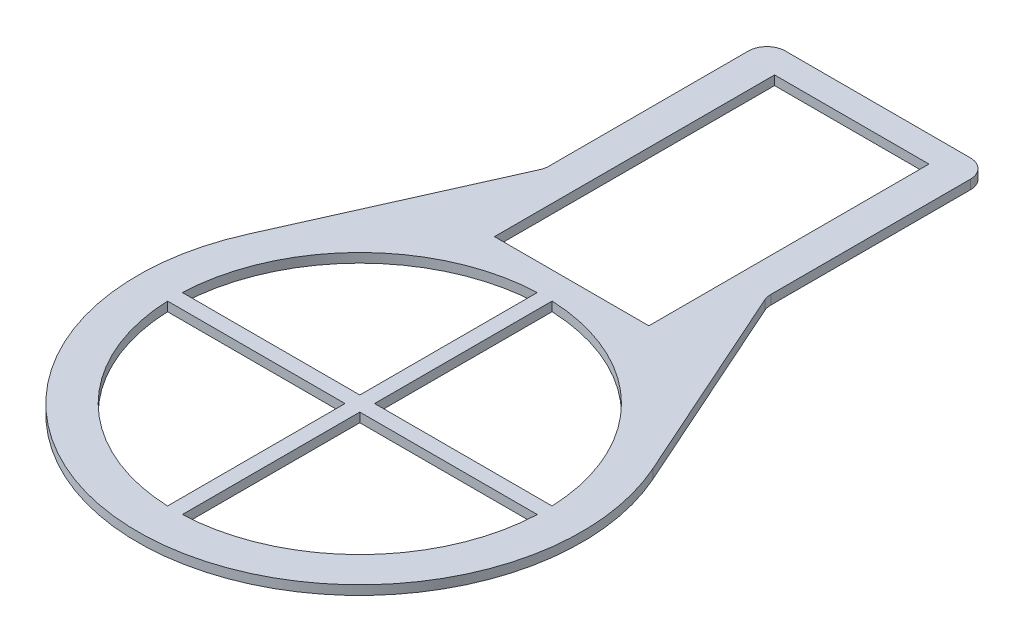
ISO-10303-21;
HEADER;
FILE_DESCRIPTION(('STEP AP214'),'2;1');
FILE_NAME('part.step','',(''),(''),'','','');
FILE_SCHEMA(('AUTOMOTIVE_DESIGN { 1 0 10303 214 1 1 1 1 }'));
ENDSEC;
DATA;
#1=APPLICATION_CONTEXT('core data for automotive mechanical design processes');
#2=APPLICATION_PROTOCOL_DEFINITION('international standard','automotive_design',2000,#1);
#3=PRODUCT_CONTEXT('',#1,'mechanical');
#4=PRODUCT('Part','Part','',(#3));
#5=PRODUCT_RELATED_PRODUCT_CATEGORY('part','',(#4));
#6=PRODUCT_DEFINITION_FORMATION('','',#4);
#7=PRODUCT_DEFINITION_CONTEXT('part definition',#1,'design');
#8=PRODUCT_DEFINITION('design','',#6,#7);
#9=PRODUCT_DEFINITION_SHAPE('','',#8);
#10=(LENGTH_UNIT() NAMED_UNIT(*) SI_UNIT(.MILLI.,.METRE.));
#11=(NAMED_UNIT(*) PLANE_ANGLE_UNIT() SI_UNIT($,.RADIAN.));
#12=(NAMED_UNIT(*) SI_UNIT($,.STERADIAN.) SOLID_ANGLE_UNIT());
#13=UNCERTAINTY_MEASURE_WITH_UNIT(LENGTH_MEASURE(1.E-05),#10,'distance_accuracy_value','');
#14=(GEOMETRIC_REPRESENTATION_CONTEXT(3) GLOBAL_UNCERTAINTY_ASSIGNED_CONTEXT((#13)) GLOBAL_UNIT_ASSIGNED_CONTEXT((#10,
#11,#12)) REPRESENTATION_CONTEXT('',''));
#15=CARTESIAN_POINT('',(0.,0.,0.));
#16=DIRECTION('',(0.,0.,1.));
#17=DIRECTION('',(1.,0.,0.));
#18=AXIS2_PLACEMENT_3D('',#15,#16,#17);
#19=CARTESIAN_POINT('',(0.,3.175,0.));
#20=DIRECTION('',(0.,-1.,0.));
#21=DIRECTION('',(0.,0.,-1.));
#22=AXIS2_PLACEMENT_3D('',#19,#20,#21);
#23=CYLINDRICAL_SURFACE('',#22,76.2);
#24=CARTESIAN_POINT('',(0.,0.,0.));
#25=DIRECTION('',(0.,1.,0.));
#26=DIRECTION('',(0.,0.,1.));
#27=AXIS2_PLACEMENT_3D('',#24,#25,#26);
#28=CIRCLE('',#27,76.2);
#29=CARTESIAN_POINT('',(-69.5842744995862,0.,-31.0558970626552));
#30=VERTEX_POINT('',#29);
#31=CARTESIAN_POINT('',(69.5842744995862,0.,-31.0558970626552));
#32=VERTEX_POINT('',#31);
#33=EDGE_CURVE('E335',#30,#32,#28,.T.);
#34=ORIENTED_EDGE('',*,*,#33,.T.);
#35=DIRECTION('',(0.,-1.,0.));
#36=VECTOR('',#35,1.);
#37=CARTESIAN_POINT('',(69.5842744995862,3.175,-31.0558970626552));
#38=LINE('',#37,#36);
#39=CARTESIAN_POINT('',(69.5842744995862,3.175,-31.0558970626552));
#40=VERTEX_POINT('',#39);
#41=EDGE_CURVE('E374',#40,#32,#38,.T.);
#42=ORIENTED_EDGE('',*,*,#41,.F.);
#43=CARTESIAN_POINT('',(0.,3.175,0.));
#44=DIRECTION('',(0.,1.,0.));
#45=DIRECTION('',(0.,0.,1.));
#46=AXIS2_PLACEMENT_3D('',#43,#44,#45);
#47=CIRCLE('',#46,76.2);
#48=CARTESIAN_POINT('',(-69.5842744995862,3.175,-31.0558970626552));
#49=VERTEX_POINT('',#48);
#50=EDGE_CURVE('E340',#49,#40,#47,.T.);
#51=ORIENTED_EDGE('',*,*,#50,.F.);
#52=DIRECTION('',(0.,-1.,0.));
#53=VECTOR('',#52,1.);
#54=CARTESIAN_POINT('',(-69.5842744995862,3.175,-31.0558970626552));
#55=LINE('',#54,#53);
#56=EDGE_CURVE('E357',#49,#30,#55,.T.);
#57=ORIENTED_EDGE('',*,*,#56,.T.);
#58=EDGE_LOOP('',(#34,#42,#51,#57));
#59=FACE_BOUND('',#58,.T.);
#60=ADVANCED_FACE('F35',(#59),#23,.T.);
#61=CARTESIAN_POINT('',(69.5842744995862,3.175,-31.0558970626552));
#62=DIRECTION('',(0.913179455375147,0.,-0.40755770423432));
#63=DIRECTION('',(-0.40755770423432,0.,-0.913179455375147));
#64=AXIS2_PLACEMENT_3D('',#61,#62,#63);
#65=PLANE('',#64);
#66=DIRECTION('',(0.40755770423432,0.,0.913179455375148));
#67=VECTOR('',#66,1.);
#68=CARTESIAN_POINT('',(69.5842744995862,0.,-31.0558970626552));
#69=LINE('',#68,#67);
#70=CARTESIAN_POINT('',(38.6513104583678,0.,-100.364726126179));
#71=VERTEX_POINT('',#70);
#72=EDGE_CURVE('E360',#71,#32,#69,.T.);
#73=ORIENTED_EDGE('',*,*,#72,.F.);
#74=DIRECTION('',(0.,-1.,0.));
#75=VECTOR('',#74,1.);
#76=CARTESIAN_POINT('',(38.6513104583678,3.175,-100.364726126179));
#77=LINE('',#76,#75);
#78=CARTESIAN_POINT('',(38.6513104583678,3.175,-100.364726126179));
#79=VERTEX_POINT('',#78);
#80=EDGE_CURVE('E403',#71,#79,#77,.F.);
#81=ORIENTED_EDGE('',*,*,#80,.T.);
#82=DIRECTION('',(0.40755770423432,0.,0.913179455375148));
#83=VECTOR('',#82,1.);
#84=CARTESIAN_POINT('',(69.5842744995862,3.175,-31.0558970626552));
#85=LINE('',#84,#83);
#86=EDGE_CURVE('E343',#79,#40,#85,.T.);
#87=ORIENTED_EDGE('',*,*,#86,.T.);
#88=ORIENTED_EDGE('',*,*,#41,.T.);
#89=EDGE_LOOP('',(#73,#81,#87,#88));
#90=FACE_BOUND('',#89,.T.);
#91=ADVANCED_FACE('F417',(#90),#65,.T.);
#92=CARTESIAN_POINT('',(38.1000000000001,3.175,0.));
#93=DIRECTION('',(1.,0.,0.));
#94=DIRECTION('',(0.,0.,-1.));
#95=AXIS2_PLACEMENT_3D('',#92,#93,#94);
#96=PLANE('',#95);
#97=DIRECTION('',(0.,0.,1.));
#98=VECTOR('',#97,1.);
#99=CARTESIAN_POINT('',(38.1000000000001,3.175,0.));
#100=LINE('',#99,#98);
#101=CARTESIAN_POINT('',(38.1,3.175,-171.45));
#102=VERTEX_POINT('',#101);
#103=CARTESIAN_POINT('',(38.1,3.175,-102.952717548067));
#104=VERTEX_POINT('',#103);
#105=EDGE_CURVE('E346',#102,#104,#100,.T.);
#106=ORIENTED_EDGE('',*,*,#105,.T.);
#107=DIRECTION('',(0.,-1.,0.));
#108=VECTOR('',#107,1.);
#109=CARTESIAN_POINT('',(38.1,0.,-102.952717548067));
#110=LINE('',#109,#108);
#111=CARTESIAN_POINT('',(38.1,0.,-102.952717548067));
#112=VERTEX_POINT('',#111);
#113=EDGE_CURVE('E400',#104,#112,#110,.T.);
#114=ORIENTED_EDGE('',*,*,#113,.T.);
#115=DIRECTION('',(0.,0.,1.));
#116=VECTOR('',#115,1.);
#117=CARTESIAN_POINT('',(38.1000000000001,0.,0.));
#118=LINE('',#117,#116);
#119=CARTESIAN_POINT('',(38.1,0.,-171.45));
#120=VERTEX_POINT('',#119);
#121=EDGE_CURVE('E362',#120,#112,#118,.T.);
#122=ORIENTED_EDGE('',*,*,#121,.F.);
#123=DIRECTION('',(0.,-1.,0.));
#124=VECTOR('',#123,1.);
#125=CARTESIAN_POINT('',(38.1,3.175,-171.45));
#126=LINE('',#125,#124);
#127=EDGE_CURVE('E398',#120,#102,#126,.F.);
#128=ORIENTED_EDGE('',*,*,#127,.T.);
#129=EDGE_LOOP('',(#106,#114,#122,#128));
#130=FACE_BOUND('',#129,.T.);
#131=ADVANCED_FACE('F428',(#130),#96,.T.);
#132=CARTESIAN_POINT('',(0.,3.175,-177.8));
#133=DIRECTION('',(0.,0.,-1.));
#134=DIRECTION('',(-1.,0.,0.));
#135=AXIS2_PLACEMENT_3D('',#132,#133,#134);
#136=PLANE('',#135);
#137=DIRECTION('',(1.,0.,0.));
#138=VECTOR('',#137,1.);
#139=CARTESIAN_POINT('',(0.,0.,-177.8));
#140=LINE('',#139,#138);
#141=CARTESIAN_POINT('',(-31.75,0.,-177.8));
#142=VERTEX_POINT('',#141);
#143=CARTESIAN_POINT('',(31.75,0.,-177.8));
#144=VERTEX_POINT('',#143);
#145=EDGE_CURVE('E365',#142,#144,#140,.T.);
#146=ORIENTED_EDGE('',*,*,#145,.F.);
#147=DIRECTION('',(0.,-1.,0.));
#148=VECTOR('',#147,1.);
#149=CARTESIAN_POINT('',(-31.75,3.175,-177.8));
#150=LINE('',#149,#148);
#151=CARTESIAN_POINT('',(-31.75,3.175,-177.8));
#152=VERTEX_POINT('',#151);
#153=EDGE_CURVE('E392',#142,#152,#150,.F.);
#154=ORIENTED_EDGE('',*,*,#153,.T.);
#155=DIRECTION('',(1.,0.,0.));
#156=VECTOR('',#155,1.);
#157=CARTESIAN_POINT('',(0.,3.175,-177.8));
#158=LINE('',#157,#156);
#159=CARTESIAN_POINT('',(31.75,3.175,-177.8));
#160=VERTEX_POINT('',#159);
#161=EDGE_CURVE('E349',#152,#160,#158,.T.);
#162=ORIENTED_EDGE('',*,*,#161,.T.);
#163=DIRECTION('',(0.,-1.,0.));
#164=VECTOR('',#163,1.);
#165=CARTESIAN_POINT('',(31.75,3.175,-177.8));
#166=LINE('',#165,#164);
#167=EDGE_CURVE('E389',#160,#144,#166,.T.);
#168=ORIENTED_EDGE('',*,*,#167,.T.);
#169=EDGE_LOOP('',(#146,#154,#162,#168));
#170=FACE_BOUND('',#169,.T.);
#171=ADVANCED_FACE('F435',(#170),#136,.T.);
#172=CARTESIAN_POINT('',(-38.1,3.175,0.));
#173=DIRECTION('',(1.,0.,0.));
#174=DIRECTION('',(0.,0.,-1.));
#175=AXIS2_PLACEMENT_3D('',#172,#173,#174);
#176=PLANE('',#175);
#177=DIRECTION('',(0.,0.,1.));
#178=VECTOR('',#177,1.);
#179=CARTESIAN_POINT('',(-38.1,0.,0.));
#180=LINE('',#179,#178);
#181=CARTESIAN_POINT('',(-38.1,0.,-171.45));
#182=VERTEX_POINT('',#181);
#183=CARTESIAN_POINT('',(-38.1,0.,-102.952717548067));
#184=VERTEX_POINT('',#183);
#185=EDGE_CURVE('E368',#182,#184,#180,.T.);
#186=ORIENTED_EDGE('',*,*,#185,.T.);
#187=DIRECTION('',(0.,-1.,0.));
#188=VECTOR('',#187,1.);
#189=CARTESIAN_POINT('',(-38.1,3.175,-102.952717548067));
#190=LINE('',#189,#188);
#191=CARTESIAN_POINT('',(-38.1,3.175,-102.952717548067));
#192=VERTEX_POINT('',#191);
#193=EDGE_CURVE('E383',#184,#192,#190,.F.);
#194=ORIENTED_EDGE('',*,*,#193,.T.);
#195=DIRECTION('',(0.,0.,1.));
#196=VECTOR('',#195,1.);
#197=CARTESIAN_POINT('',(-38.1,3.175,0.));
#198=LINE('',#197,#196);
#199=CARTESIAN_POINT('',(-38.1,3.175,-171.45));
#200=VERTEX_POINT('',#199);
#201=EDGE_CURVE('E352',#200,#192,#198,.T.);
#202=ORIENTED_EDGE('',*,*,#201,.F.);
#203=DIRECTION('',(0.,-1.,0.));
#204=VECTOR('',#203,1.);
#205=CARTESIAN_POINT('',(-38.1,0.,-171.45));
#206=LINE('',#205,#204);
#207=EDGE_CURVE('E380',#200,#182,#206,.T.);
#208=ORIENTED_EDGE('',*,*,#207,.T.);
#209=EDGE_LOOP('',(#186,#194,#202,#208));
#210=FACE_BOUND('',#209,.T.);
#211=ADVANCED_FACE('F443',(#210),#176,.F.);
#212=CARTESIAN_POINT('',(-69.5842744995862,3.175,-31.0558970626552));
#213=DIRECTION('',(0.913179455375147,0.,0.40755770423432));
#214=DIRECTION('',(0.40755770423432,0.,-0.913179455375147));
#215=AXIS2_PLACEMENT_3D('',#212,#213,#214);
#216=PLANE('',#215);
#217=DIRECTION('',(-0.40755770423432,0.,0.913179455375147));
#218=VECTOR('',#217,1.);
#219=CARTESIAN_POINT('',(-69.5842744995862,3.175,-31.0558970626552));
#220=LINE('',#219,#218);
#221=CARTESIAN_POINT('',(-38.6513104583678,3.175,-100.364726126179));
#222=VERTEX_POINT('',#221);
#223=EDGE_CURVE('E355',#222,#49,#220,.T.);
#224=ORIENTED_EDGE('',*,*,#223,.F.);
#225=DIRECTION('',(0.,-1.,0.));
#226=VECTOR('',#225,1.);
#227=CARTESIAN_POINT('',(-38.6513104583678,0.,-100.364726126179));
#228=LINE('',#227,#226);
#229=CARTESIAN_POINT('',(-38.6513104583678,0.,-100.364726126179));
#230=VERTEX_POINT('',#229);
#231=EDGE_CURVE('E377',#222,#230,#228,.T.);
#232=ORIENTED_EDGE('',*,*,#231,.T.);
#233=DIRECTION('',(-0.40755770423432,0.,0.913179455375147));
#234=VECTOR('',#233,1.);
#235=CARTESIAN_POINT('',(-69.5842744995862,0.,-31.0558970626552));
#236=LINE('',#235,#234);
#237=EDGE_CURVE('E344',#230,#30,#236,.T.);
#238=ORIENTED_EDGE('',*,*,#237,.T.);
#239=ORIENTED_EDGE('',*,*,#56,.F.);
#240=EDGE_LOOP('',(#224,#232,#238,#239));
#241=FACE_BOUND('',#240,.T.);
#242=ADVANCED_FACE('F451',(#241),#216,.F.);
#243=CARTESIAN_POINT('',(0.,3.175,0.));
#244=DIRECTION('',(0.,1.,0.));
#245=DIRECTION('',(0.,0.,1.));
#246=AXIS2_PLACEMENT_3D('',#243,#244,#245);
#247=PLANE('',#246);
#248=DIRECTION('',(0.,0.,-1.));
#249=VECTOR('',#248,1.);
#250=CARTESIAN_POINT('',(26.4947526390494,3.175,-72.7091223745985));
#251=LINE('',#250,#249);
#252=CARTESIAN_POINT('',(26.4947526390494,3.175,-72.7091223745985));
#253=VERTEX_POINT('',#252);
#254=CARTESIAN_POINT('',(26.4947526390494,3.175,-168.837519770124));
#255=VERTEX_POINT('',#254);
#256=EDGE_CURVE('E50',#253,#255,#251,.T.);
#257=ORIENTED_EDGE('',*,*,#256,.F.);
#258=DIRECTION('',(1.,0.,0.));
#259=VECTOR('',#258,1.);
#260=CARTESIAN_POINT('',(-26.4947526390494,3.175,-72.7091223745985));
#261=LINE('',#260,#259);
#262=CARTESIAN_POINT('',(-26.4947526390494,3.175,-72.7091223745985));
#263=VERTEX_POINT('',#262);
#264=EDGE_CURVE('E225',#263,#253,#261,.T.);
#265=ORIENTED_EDGE('',*,*,#264,.F.);
#266=DIRECTION('',(0.,0.,1.));
#267=VECTOR('',#266,1.);
#268=CARTESIAN_POINT('',(-26.4947526390494,3.175,-72.7091223745985));
#269=LINE('',#268,#267);
#270=CARTESIAN_POINT('',(-26.4947526390494,3.175,-168.837519770124));
#271=VERTEX_POINT('',#270);
#272=EDGE_CURVE('E228',#271,#263,#269,.T.);
#273=ORIENTED_EDGE('',*,*,#272,.F.);
#274=DIRECTION('',(-1.,0.,0.));
#275=VECTOR('',#274,1.);
#276=CARTESIAN_POINT('',(-26.4947526390494,3.175,-168.837519770124));
#277=LINE('',#276,#275);
#278=EDGE_CURVE('E234',#255,#271,#277,.T.);
#279=ORIENTED_EDGE('',*,*,#278,.F.);
#280=EDGE_LOOP('',(#257,#265,#273,#279));
#281=FACE_BOUND('',#280,.T.);
#282=DIRECTION('',(-1.,0.,0.));
#283=VECTOR('',#282,1.);
#284=CARTESIAN_POINT('',(0.,3.175,2.54));
#285=LINE('',#284,#283);
#286=CARTESIAN_POINT('',(-2.54,3.175,2.54));
#287=VERTEX_POINT('',#286);
#288=CARTESIAN_POINT('',(-63.4491796637277,3.175,2.54));
#289=VERTEX_POINT('',#288);
#290=EDGE_CURVE('E240',#287,#289,#285,.T.);
#291=ORIENTED_EDGE('',*,*,#290,.F.);
#292=DIRECTION('',(0.,0.,1.));
#293=VECTOR('',#292,1.);
#294=CARTESIAN_POINT('',(-2.54,3.175,0.));
#295=LINE('',#294,#293);
#296=CARTESIAN_POINT('',(-2.54,3.175,63.4491796637277));
#297=VERTEX_POINT('',#296);
#298=EDGE_CURVE('E298',#287,#297,#295,.T.);
#299=ORIENTED_EDGE('',*,*,#298,.T.);
#300=CARTESIAN_POINT('',(0.,3.175,0.));
#301=DIRECTION('',(0.,1.,0.));
#302=DIRECTION('',(0.,0.,1.));
#303=AXIS2_PLACEMENT_3D('',#300,#301,#302);
#304=CIRCLE('',#303,63.5);
#305=EDGE_CURVE('E306',#289,#297,#304,.T.);
#306=ORIENTED_EDGE('',*,*,#305,.F.);
#307=EDGE_LOOP('',(#291,#299,#306));
#308=FACE_BOUND('',#307,.T.);
#309=DIRECTION('',(0.,0.,1.));
#310=VECTOR('',#309,1.);
#311=CARTESIAN_POINT('',(2.54,3.175,0.));
#312=LINE('',#311,#310);
#313=CARTESIAN_POINT('',(2.54,3.175,2.54));
#314=VERTEX_POINT('',#313);
#315=CARTESIAN_POINT('',(2.54,3.175,63.4491796637277));
#316=VERTEX_POINT('',#315);
#317=EDGE_CURVE('E281',#314,#316,#312,.T.);
#318=ORIENTED_EDGE('',*,*,#317,.F.);
#319=DIRECTION('',(1.,0.,0.));
#320=VECTOR('',#319,1.);
#321=CARTESIAN_POINT('',(0.,3.175,2.54));
#322=LINE('',#321,#320);
#323=CARTESIAN_POINT('',(63.4491796637277,3.175,2.54));
#324=VERTEX_POINT('',#323);
#325=EDGE_CURVE('E274',#314,#324,#322,.T.);
#326=ORIENTED_EDGE('',*,*,#325,.T.);
#327=CARTESIAN_POINT('',(0.,3.175,0.));
#328=DIRECTION('',(0.,1.,0.));
#329=DIRECTION('',(0.,0.,1.));
#330=AXIS2_PLACEMENT_3D('',#327,#328,#329);
#331=CIRCLE('',#330,63.5);
#332=EDGE_CURVE('E283',#316,#324,#331,.T.);
#333=ORIENTED_EDGE('',*,*,#332,.F.);
#334=EDGE_LOOP('',(#318,#326,#333));
#335=FACE_BOUND('',#334,.T.);
#336=DIRECTION('',(1.,0.,0.));
#337=VECTOR('',#336,1.);
#338=CARTESIAN_POINT('',(0.,3.175,-2.54));
#339=LINE('',#338,#337);
#340=CARTESIAN_POINT('',(2.54,3.175,-2.54));
#341=VERTEX_POINT('',#340);
#342=CARTESIAN_POINT('',(63.4491796637277,3.175,-2.54));
#343=VERTEX_POINT('',#342);
#344=EDGE_CURVE('E255',#341,#343,#339,.T.);
#345=ORIENTED_EDGE('',*,*,#344,.F.);
#346=DIRECTION('',(0.,0.,-1.));
#347=VECTOR('',#346,1.);
#348=CARTESIAN_POINT('',(2.54,3.175,0.));
#349=LINE('',#348,#347);
#350=CARTESIAN_POINT('',(2.54,3.175,-63.4491796637277));
#351=VERTEX_POINT('',#350);
#352=EDGE_CURVE('E248',#341,#351,#349,.T.);
#353=ORIENTED_EDGE('',*,*,#352,.T.);
#354=CARTESIAN_POINT('',(0.,3.175,0.));
#355=DIRECTION('',(0.,1.,0.));
#356=DIRECTION('',(0.,0.,1.));
#357=AXIS2_PLACEMENT_3D('',#354,#355,#356);
#358=CIRCLE('',#357,63.5);
#359=EDGE_CURVE('E257',#343,#351,#358,.T.);
#360=ORIENTED_EDGE('',*,*,#359,.F.);
#361=EDGE_LOOP('',(#345,#353,#360));
#362=FACE_BOUND('',#361,.T.);
#363=DIRECTION('',(0.,0.,-1.));
#364=VECTOR('',#363,1.);
#365=CARTESIAN_POINT('',(-2.54,3.175,0.));
#366=LINE('',#365,#364);
#367=CARTESIAN_POINT('',(-2.54,3.175,-2.54));
#368=VERTEX_POINT('',#367);
#369=CARTESIAN_POINT('',(-2.54,3.175,-63.4491796637277));
#370=VERTEX_POINT('',#369);
#371=EDGE_CURVE('E265',#368,#370,#366,.T.);
#372=ORIENTED_EDGE('',*,*,#371,.F.);
#373=DIRECTION('',(-1.,0.,0.));
#374=VECTOR('',#373,1.);
#375=CARTESIAN_POINT('',(0.,3.175,-2.54));
#376=LINE('',#375,#374);
#377=CARTESIAN_POINT('',(-63.4491796637277,3.175,-2.54));
#378=VERTEX_POINT('',#377);
#379=EDGE_CURVE('E320',#368,#378,#376,.T.);
#380=ORIENTED_EDGE('',*,*,#379,.T.);
#381=CARTESIAN_POINT('',(0.,3.175,0.));
#382=DIRECTION('',(0.,1.,0.));
#383=DIRECTION('',(0.,0.,1.));
#384=AXIS2_PLACEMENT_3D('',#381,#382,#383);
#385=CIRCLE('',#384,63.5);
#386=EDGE_CURVE('E328',#370,#378,#385,.T.);
#387=ORIENTED_EDGE('',*,*,#386,.F.);
#388=EDGE_LOOP('',(#372,#380,#387));
#389=FACE_BOUND('',#388,.T.);
#390=ORIENTED_EDGE('',*,*,#161,.F.);
#391=CARTESIAN_POINT('',(-31.75,3.175,-171.45));
#392=DIRECTION('',(0.,1.,0.));
#393=DIRECTION('',(0.,0.,1.));
#394=AXIS2_PLACEMENT_3D('',#391,#392,#393);
#395=CIRCLE('',#394,6.35);
#396=EDGE_CURVE('E396',#152,#200,#395,.T.);
#397=ORIENTED_EDGE('',*,*,#396,.T.);
#398=ORIENTED_EDGE('',*,*,#201,.T.);
#399=CARTESIAN_POINT('',(-44.45,3.175,-102.952717548067));
#400=DIRECTION('',(0.,1.,0.));
#401=DIRECTION('',(0.,0.,1.));
#402=AXIS2_PLACEMENT_3D('',#399,#400,#401);
#403=CIRCLE('',#402,6.35);
#404=EDGE_CURVE('E407',#192,#222,#403,.F.);
#405=ORIENTED_EDGE('',*,*,#404,.T.);
#406=ORIENTED_EDGE('',*,*,#223,.T.);
#407=ORIENTED_EDGE('',*,*,#50,.T.);
#408=ORIENTED_EDGE('',*,*,#86,.F.);
#409=CARTESIAN_POINT('',(44.45,3.175,-102.952717548067));
#410=DIRECTION('',(0.,1.,0.));
#411=DIRECTION('',(0.,0.,1.));
#412=AXIS2_PLACEMENT_3D('',#409,#410,#411);
#413=CIRCLE('',#412,6.35);
#414=EDGE_CURVE('E11',#79,#104,#413,.F.);
#415=ORIENTED_EDGE('',*,*,#414,.T.);
#416=ORIENTED_EDGE('',*,*,#105,.F.);
#417=CARTESIAN_POINT('',(31.75,3.175,-171.45));
#418=DIRECTION('',(0.,1.,0.));
#419=DIRECTION('',(0.,0.,1.));
#420=AXIS2_PLACEMENT_3D('',#417,#418,#419);
#421=CIRCLE('',#420,6.35);
#422=EDGE_CURVE('E394',#102,#160,#421,.T.);
#423=ORIENTED_EDGE('',*,*,#422,.T.);
#424=EDGE_LOOP('',(#390,#397,#398,#405,#406,#407,#408,#415,#416,#423));
#425=FACE_BOUND('',#424,.T.);
#426=ADVANCED_FACE('F425',(#281,#308,#335,#362,#389,#425),#247,.T.);
#427=CARTESIAN_POINT('',(0.,0.,0.));
#428=DIRECTION('',(0.,1.,0.));
#429=DIRECTION('',(0.,0.,1.));
#430=AXIS2_PLACEMENT_3D('',#427,#428,#429);
#431=PLANE('',#430);
#432=DIRECTION('',(1.,0.,0.));
#433=VECTOR('',#432,1.);
#434=CARTESIAN_POINT('',(-26.4947526390494,0.,-72.7091223745985));
#435=LINE('',#434,#433);
#436=CARTESIAN_POINT('',(-26.4947526390494,0.,-72.7091223745985));
#437=VERTEX_POINT('',#436);
#438=CARTESIAN_POINT('',(26.4947526390494,0.,-72.7091223745985));
#439=VERTEX_POINT('',#438);
#440=EDGE_CURVE('E215',#437,#439,#435,.T.);
#441=ORIENTED_EDGE('',*,*,#440,.T.);
#442=DIRECTION('',(0.,0.,-1.));
#443=VECTOR('',#442,1.);
#444=CARTESIAN_POINT('',(26.4947526390494,0.,-72.7091223745985));
#445=LINE('',#444,#443);
#446=CARTESIAN_POINT('',(26.4947526390494,0.,-168.837519770124));
#447=VERTEX_POINT('',#446);
#448=EDGE_CURVE('E209',#439,#447,#445,.T.);
#449=ORIENTED_EDGE('',*,*,#448,.T.);
#450=DIRECTION('',(-1.,0.,0.));
#451=VECTOR('',#450,1.);
#452=CARTESIAN_POINT('',(-26.4947526390494,0.,-168.837519770124));
#453=LINE('',#452,#451);
#454=CARTESIAN_POINT('',(-26.4947526390494,0.,-168.837519770124));
#455=VERTEX_POINT('',#454);
#456=EDGE_CURVE('E218',#447,#455,#453,.T.);
#457=ORIENTED_EDGE('',*,*,#456,.T.);
#458=DIRECTION('',(0.,0.,1.));
#459=VECTOR('',#458,1.);
#460=CARTESIAN_POINT('',(-26.4947526390494,0.,-72.7091223745985));
#461=LINE('',#460,#459);
#462=EDGE_CURVE('E58',#455,#437,#461,.T.);
#463=ORIENTED_EDGE('',*,*,#462,.T.);
#464=EDGE_LOOP('',(#441,#449,#457,#463));
#465=FACE_BOUND('',#464,.T.);
#466=DIRECTION('',(0.,0.,1.));
#467=VECTOR('',#466,1.);
#468=CARTESIAN_POINT('',(-2.54,0.,0.));
#469=LINE('',#468,#467);
#470=CARTESIAN_POINT('',(-2.54,0.,2.54));
#471=VERTEX_POINT('',#470);
#472=CARTESIAN_POINT('',(-2.54,0.,63.4491796637277));
#473=VERTEX_POINT('',#472);
#474=EDGE_CURVE('E301',#471,#473,#469,.T.);
#475=ORIENTED_EDGE('',*,*,#474,.F.);
#476=DIRECTION('',(-1.,0.,0.));
#477=VECTOR('',#476,1.);
#478=CARTESIAN_POINT('',(0.,0.,2.54));
#479=LINE('',#478,#477);
#480=CARTESIAN_POINT('',(-63.4491796637277,0.,2.54));
#481=VERTEX_POINT('',#480);
#482=EDGE_CURVE('E294',#471,#481,#479,.T.);
#483=ORIENTED_EDGE('',*,*,#482,.T.);
#484=CARTESIAN_POINT('',(0.,0.,0.));
#485=DIRECTION('',(0.,1.,0.));
#486=DIRECTION('',(0.,0.,1.));
#487=AXIS2_PLACEMENT_3D('',#484,#485,#486);
#488=CIRCLE('',#487,63.5);
#489=EDGE_CURVE('E297',#481,#473,#488,.T.);
#490=ORIENTED_EDGE('',*,*,#489,.T.);
#491=EDGE_LOOP('',(#475,#483,#490));
#492=FACE_BOUND('',#491,.T.);
#493=DIRECTION('',(1.,0.,0.));
#494=VECTOR('',#493,1.);
#495=CARTESIAN_POINT('',(0.,0.,2.54));
#496=LINE('',#495,#494);
#497=CARTESIAN_POINT('',(2.54,0.,2.54));
#498=VERTEX_POINT('',#497);
#499=CARTESIAN_POINT('',(63.4491796637277,0.,2.54));
#500=VERTEX_POINT('',#499);
#501=EDGE_CURVE('E277',#498,#500,#496,.T.);
#502=ORIENTED_EDGE('',*,*,#501,.F.);
#503=DIRECTION('',(0.,0.,1.));
#504=VECTOR('',#503,1.);
#505=CARTESIAN_POINT('',(2.54,0.,0.));
#506=LINE('',#505,#504);
#507=CARTESIAN_POINT('',(2.54,0.,63.4491796637277));
#508=VERTEX_POINT('',#507);
#509=EDGE_CURVE('E270',#498,#508,#506,.T.);
#510=ORIENTED_EDGE('',*,*,#509,.T.);
#511=CARTESIAN_POINT('',(0.,0.,0.));
#512=DIRECTION('',(0.,1.,0.));
#513=DIRECTION('',(0.,0.,1.));
#514=AXIS2_PLACEMENT_3D('',#511,#512,#513);
#515=CIRCLE('',#514,63.5);
#516=EDGE_CURVE('E273',#508,#500,#515,.T.);
#517=ORIENTED_EDGE('',*,*,#516,.T.);
#518=EDGE_LOOP('',(#502,#510,#517));
#519=FACE_BOUND('',#518,.T.);
#520=DIRECTION('',(0.,0.,-1.));
#521=VECTOR('',#520,1.);
#522=CARTESIAN_POINT('',(2.54,0.,0.));
#523=LINE('',#522,#521);
#524=CARTESIAN_POINT('',(2.54,0.,-2.54));
#525=VERTEX_POINT('',#524);
#526=CARTESIAN_POINT('',(2.54,0.,-63.4491796637277));
#527=VERTEX_POINT('',#526);
#528=EDGE_CURVE('E251',#525,#527,#523,.T.);
#529=ORIENTED_EDGE('',*,*,#528,.F.);
#530=DIRECTION('',(1.,0.,0.));
#531=VECTOR('',#530,1.);
#532=CARTESIAN_POINT('',(0.,0.,-2.54));
#533=LINE('',#532,#531);
#534=CARTESIAN_POINT('',(63.4491796637277,0.,-2.54));
#535=VERTEX_POINT('',#534);
#536=EDGE_CURVE('E244',#525,#535,#533,.T.);
#537=ORIENTED_EDGE('',*,*,#536,.T.);
#538=CARTESIAN_POINT('',(0.,0.,0.));
#539=DIRECTION('',(0.,1.,0.));
#540=DIRECTION('',(0.,0.,1.));
#541=AXIS2_PLACEMENT_3D('',#538,#539,#540);
#542=CIRCLE('',#541,63.5);
#543=EDGE_CURVE('E247',#535,#527,#542,.T.);
#544=ORIENTED_EDGE('',*,*,#543,.T.);
#545=EDGE_LOOP('',(#529,#537,#544));
#546=FACE_BOUND('',#545,.T.);
#547=DIRECTION('',(-1.,0.,0.));
#548=VECTOR('',#547,1.);
#549=CARTESIAN_POINT('',(0.,0.,-2.54));
#550=LINE('',#549,#548);
#551=CARTESIAN_POINT('',(-2.54,0.,-2.54));
#552=VERTEX_POINT('',#551);
#553=CARTESIAN_POINT('',(-63.4491796637277,0.,-2.54));
#554=VERTEX_POINT('',#553);
#555=EDGE_CURVE('E323',#552,#554,#550,.T.);
#556=ORIENTED_EDGE('',*,*,#555,.F.);
#557=DIRECTION('',(0.,0.,-1.));
#558=VECTOR('',#557,1.);
#559=CARTESIAN_POINT('',(-2.54,0.,0.));
#560=LINE('',#559,#558);
#561=CARTESIAN_POINT('',(-2.54,0.,-63.4491796637277));
#562=VERTEX_POINT('',#561);
#563=EDGE_CURVE('E316',#552,#562,#560,.T.);
#564=ORIENTED_EDGE('',*,*,#563,.T.);
#565=CARTESIAN_POINT('',(0.,0.,0.));
#566=DIRECTION('',(0.,1.,0.));
#567=DIRECTION('',(0.,0.,1.));
#568=AXIS2_PLACEMENT_3D('',#565,#566,#567);
#569=CIRCLE('',#568,63.5);
#570=EDGE_CURVE('E319',#562,#554,#569,.T.);
#571=ORIENTED_EDGE('',*,*,#570,.T.);
#572=EDGE_LOOP('',(#556,#564,#571));
#573=FACE_BOUND('',#572,.T.);
#574=ORIENTED_EDGE('',*,*,#185,.F.);
#575=CARTESIAN_POINT('',(-31.75,0.,-171.45));
#576=DIRECTION('',(0.,1.,0.));
#577=DIRECTION('',(0.,0.,1.));
#578=AXIS2_PLACEMENT_3D('',#575,#576,#577);
#579=CIRCLE('',#578,6.35);
#580=EDGE_CURVE('E387',#182,#142,#579,.F.);
#581=ORIENTED_EDGE('',*,*,#580,.T.);
#582=ORIENTED_EDGE('',*,*,#145,.T.);
#583=CARTESIAN_POINT('',(31.75,0.,-171.45));
#584=DIRECTION('',(0.,1.,0.));
#585=DIRECTION('',(0.,0.,1.));
#586=AXIS2_PLACEMENT_3D('',#583,#584,#585);
#587=CIRCLE('',#586,6.35);
#588=EDGE_CURVE('E385',#144,#120,#587,.F.);
#589=ORIENTED_EDGE('',*,*,#588,.T.);
#590=ORIENTED_EDGE('',*,*,#121,.T.);
#591=CARTESIAN_POINT('',(44.45,0.,-102.952717548067));
#592=DIRECTION('',(0.,1.,0.));
#593=DIRECTION('',(0.,0.,1.));
#594=AXIS2_PLACEMENT_3D('',#591,#592,#593);
#595=CIRCLE('',#594,6.35);
#596=EDGE_CURVE('E43',#112,#71,#595,.T.);
#597=ORIENTED_EDGE('',*,*,#596,.T.);
#598=ORIENTED_EDGE('',*,*,#72,.T.);
#599=ORIENTED_EDGE('',*,*,#33,.F.);
#600=ORIENTED_EDGE('',*,*,#237,.F.);
#601=CARTESIAN_POINT('',(-44.45,0.,-102.952717548067));
#602=DIRECTION('',(0.,1.,0.));
#603=DIRECTION('',(0.,0.,1.));
#604=AXIS2_PLACEMENT_3D('',#601,#602,#603);
#605=CIRCLE('',#604,6.35);
#606=EDGE_CURVE('E405',#230,#184,#605,.T.);
#607=ORIENTED_EDGE('',*,*,#606,.T.);
#608=EDGE_LOOP('',(#574,#581,#582,#589,#590,#597,#598,#599,#600,#607));
#609=FACE_BOUND('',#608,.T.);
#610=ADVANCED_FACE('F222',(#465,#492,#519,#546,#573,#609),#431,.F.);
#611=CARTESIAN_POINT('',(-44.45,3.175,-102.952717548067));
#612=DIRECTION('',(0.,1.,0.));
#613=DIRECTION('',(0.,0.,1.));
#614=AXIS2_PLACEMENT_3D('',#611,#612,#613);
#615=CYLINDRICAL_SURFACE('',#614,6.35);
#616=ORIENTED_EDGE('',*,*,#404,.F.);
#617=ORIENTED_EDGE('',*,*,#193,.F.);
#618=ORIENTED_EDGE('',*,*,#606,.F.);
#619=ORIENTED_EDGE('',*,*,#231,.F.);
#620=EDGE_LOOP('',(#616,#617,#618,#619));
#621=FACE_BOUND('',#620,.T.);
#622=ADVANCED_FACE('F446',(#621),#615,.F.);
#623=CARTESIAN_POINT('',(-31.75,3.175,-171.45));
#624=DIRECTION('',(0.,1.,0.));
#625=DIRECTION('',(0.,0.,1.));
#626=AXIS2_PLACEMENT_3D('',#623,#624,#625);
#627=CYLINDRICAL_SURFACE('',#626,6.35);
#628=ORIENTED_EDGE('',*,*,#396,.F.);
#629=ORIENTED_EDGE('',*,*,#153,.F.);
#630=ORIENTED_EDGE('',*,*,#580,.F.);
#631=ORIENTED_EDGE('',*,*,#207,.F.);
#632=EDGE_LOOP('',(#628,#629,#630,#631));
#633=FACE_BOUND('',#632,.T.);
#634=ADVANCED_FACE('F438',(#633),#627,.T.);
#635=CARTESIAN_POINT('',(44.45,3.175,-102.952717548067));
#636=DIRECTION('',(0.,1.,0.));
#637=DIRECTION('',(0.,0.,1.));
#638=AXIS2_PLACEMENT_3D('',#635,#636,#637);
#639=CYLINDRICAL_SURFACE('',#638,6.35);
#640=ORIENTED_EDGE('',*,*,#414,.F.);
#641=ORIENTED_EDGE('',*,*,#80,.F.);
#642=ORIENTED_EDGE('',*,*,#596,.F.);
#643=ORIENTED_EDGE('',*,*,#113,.F.);
#644=EDGE_LOOP('',(#640,#641,#642,#643));
#645=FACE_BOUND('',#644,.T.);
#646=ADVANCED_FACE('F421',(#645),#639,.F.);
#647=CARTESIAN_POINT('',(31.75,3.175,-171.45));
#648=DIRECTION('',(0.,-1.,0.));
#649=DIRECTION('',(0.,0.,-1.));
#650=AXIS2_PLACEMENT_3D('',#647,#648,#649);
#651=CYLINDRICAL_SURFACE('',#650,6.35);
#652=ORIENTED_EDGE('',*,*,#422,.F.);
#653=ORIENTED_EDGE('',*,*,#127,.F.);
#654=ORIENTED_EDGE('',*,*,#588,.F.);
#655=ORIENTED_EDGE('',*,*,#167,.F.);
#656=EDGE_LOOP('',(#652,#653,#654,#655));
#657=FACE_BOUND('',#656,.T.);
#658=ADVANCED_FACE('F37',(#657),#651,.T.);
#659=CARTESIAN_POINT('',(-2.54,0.,0.));
#660=DIRECTION('',(1.,0.,0.));
#661=DIRECTION('',(0.,0.,-1.));
#662=AXIS2_PLACEMENT_3D('',#659,#660,#661);
#663=PLANE('',#662);
#664=ORIENTED_EDGE('',*,*,#371,.T.);
#665=DIRECTION('',(0.,1.,0.));
#666=VECTOR('',#665,1.);
#667=CARTESIAN_POINT('',(-2.54,0.,-63.4491796637277));
#668=LINE('',#667,#666);
#669=EDGE_CURVE('E326',#562,#370,#668,.T.);
#670=ORIENTED_EDGE('',*,*,#669,.F.);
#671=ORIENTED_EDGE('',*,*,#563,.F.);
#672=DIRECTION('',(0.,1.,0.));
#673=VECTOR('',#672,1.);
#674=CARTESIAN_POINT('',(-2.54,0.,-2.54));
#675=LINE('',#674,#673);
#676=EDGE_CURVE('E333',#552,#368,#675,.T.);
#677=ORIENTED_EDGE('',*,*,#676,.T.);
#678=EDGE_LOOP('',(#664,#670,#671,#677));
#679=FACE_BOUND('',#678,.T.);
#680=ADVANCED_FACE('F470',(#679),#663,.F.);
#681=CARTESIAN_POINT('',(0.,0.,-2.54));
#682=DIRECTION('',(0.,0.,-1.));
#683=DIRECTION('',(-1.,0.,0.));
#684=AXIS2_PLACEMENT_3D('',#681,#682,#683);
#685=PLANE('',#684);
#686=ORIENTED_EDGE('',*,*,#379,.F.);
#687=ORIENTED_EDGE('',*,*,#676,.F.);
#688=ORIENTED_EDGE('',*,*,#555,.T.);
#689=DIRECTION('',(0.,1.,0.));
#690=VECTOR('',#689,1.);
#691=CARTESIAN_POINT('',(-63.4491796637277,0.,-2.54));
#692=LINE('',#691,#690);
#693=EDGE_CURVE('E336',#554,#378,#692,.T.);
#694=ORIENTED_EDGE('',*,*,#693,.T.);
#695=EDGE_LOOP('',(#686,#687,#688,#694));
#696=FACE_BOUND('',#695,.T.);
#697=ADVANCED_FACE('F474',(#696),#685,.T.);
#698=CARTESIAN_POINT('',(0.,0.,0.));
#699=DIRECTION('',(0.,1.,0.));
#700=DIRECTION('',(0.,0.,1.));
#701=AXIS2_PLACEMENT_3D('',#698,#699,#700);
#702=CYLINDRICAL_SURFACE('',#701,63.5);
#703=ORIENTED_EDGE('',*,*,#386,.T.);
#704=ORIENTED_EDGE('',*,*,#693,.F.);
#705=ORIENTED_EDGE('',*,*,#570,.F.);
#706=ORIENTED_EDGE('',*,*,#669,.T.);
#707=EDGE_LOOP('',(#703,#704,#705,#706));
#708=FACE_BOUND('',#707,.T.);
#709=ADVANCED_FACE('F480',(#708),#702,.F.);
#710=CARTESIAN_POINT('',(0.,0.,-2.54));
#711=DIRECTION('',(0.,0.,1.));
#712=DIRECTION('',(1.,0.,0.));
#713=AXIS2_PLACEMENT_3D('',#710,#711,#712);
#714=PLANE('',#713);
#715=ORIENTED_EDGE('',*,*,#344,.T.);
#716=DIRECTION('',(0.,1.,0.));
#717=VECTOR('',#716,1.);
#718=CARTESIAN_POINT('',(63.4491796637277,0.,-2.54));
#719=LINE('',#718,#717);
#720=EDGE_CURVE('E254',#535,#343,#719,.T.);
#721=ORIENTED_EDGE('',*,*,#720,.F.);
#722=ORIENTED_EDGE('',*,*,#536,.F.);
#723=DIRECTION('',(0.,1.,0.));
#724=VECTOR('',#723,1.);
#725=CARTESIAN_POINT('',(2.54,0.,-2.54));
#726=LINE('',#725,#724);
#727=EDGE_CURVE('E263',#525,#341,#726,.T.);
#728=ORIENTED_EDGE('',*,*,#727,.T.);
#729=EDGE_LOOP('',(#715,#721,#722,#728));
#730=FACE_BOUND('',#729,.T.);
#731=ADVANCED_FACE('F564',(#730),#714,.F.);
#732=CARTESIAN_POINT('',(2.54,0.,0.));
#733=DIRECTION('',(1.,0.,0.));
#734=DIRECTION('',(0.,0.,-1.));
#735=AXIS2_PLACEMENT_3D('',#732,#733,#734);
#736=PLANE('',#735);
#737=ORIENTED_EDGE('',*,*,#352,.F.);
#738=ORIENTED_EDGE('',*,*,#727,.F.);
#739=ORIENTED_EDGE('',*,*,#528,.T.);
#740=DIRECTION('',(0.,1.,0.));
#741=VECTOR('',#740,1.);
#742=CARTESIAN_POINT('',(2.54,0.,-63.4491796637277));
#743=LINE('',#742,#741);
#744=EDGE_CURVE('E266',#527,#351,#743,.T.);
#745=ORIENTED_EDGE('',*,*,#744,.T.);
#746=EDGE_LOOP('',(#737,#738,#739,#745));
#747=FACE_BOUND('',#746,.T.);
#748=ADVANCED_FACE('F573',(#747),#736,.T.);
#749=CARTESIAN_POINT('',(0.,0.,0.));
#750=DIRECTION('',(0.,1.,0.));
#751=DIRECTION('',(0.,0.,1.));
#752=AXIS2_PLACEMENT_3D('',#749,#750,#751);
#753=CYLINDRICAL_SURFACE('',#752,63.5);
#754=ORIENTED_EDGE('',*,*,#359,.T.);
#755=ORIENTED_EDGE('',*,*,#744,.F.);
#756=ORIENTED_EDGE('',*,*,#543,.F.);
#757=ORIENTED_EDGE('',*,*,#720,.T.);
#758=EDGE_LOOP('',(#754,#755,#756,#757));
#759=FACE_BOUND('',#758,.T.);
#760=ADVANCED_FACE('F583',(#759),#753,.F.);
#761=CARTESIAN_POINT('',(2.54,0.,0.));
#762=DIRECTION('',(-1.,0.,0.));
#763=DIRECTION('',(0.,0.,1.));
#764=AXIS2_PLACEMENT_3D('',#761,#762,#763);
#765=PLANE('',#764);
#766=ORIENTED_EDGE('',*,*,#317,.T.);
#767=DIRECTION('',(0.,1.,0.));
#768=VECTOR('',#767,1.);
#769=CARTESIAN_POINT('',(2.54,0.,63.4491796637277));
#770=LINE('',#769,#768);
#771=EDGE_CURVE('E280',#508,#316,#770,.T.);
#772=ORIENTED_EDGE('',*,*,#771,.F.);
#773=ORIENTED_EDGE('',*,*,#509,.F.);
#774=DIRECTION('',(0.,1.,0.));
#775=VECTOR('',#774,1.);
#776=CARTESIAN_POINT('',(2.54,0.,2.54));
#777=LINE('',#776,#775);
#778=EDGE_CURVE('E258',#498,#314,#777,.T.);
#779=ORIENTED_EDGE('',*,*,#778,.T.);
#780=EDGE_LOOP('',(#766,#772,#773,#779));
#781=FACE_BOUND('',#780,.T.);
#782=ADVANCED_FACE('F593',(#781),#765,.F.);
#783=CARTESIAN_POINT('',(0.,0.,2.54));
#784=DIRECTION('',(0.,0.,1.));
#785=DIRECTION('',(1.,0.,0.));
#786=AXIS2_PLACEMENT_3D('',#783,#784,#785);
#787=PLANE('',#786);
#788=ORIENTED_EDGE('',*,*,#325,.F.);
#789=ORIENTED_EDGE('',*,*,#778,.F.);
#790=ORIENTED_EDGE('',*,*,#501,.T.);
#791=DIRECTION('',(0.,1.,0.));
#792=VECTOR('',#791,1.);
#793=CARTESIAN_POINT('',(63.4491796637277,0.,2.54));
#794=LINE('',#793,#792);
#795=EDGE_CURVE('E290',#500,#324,#794,.T.);
#796=ORIENTED_EDGE('',*,*,#795,.T.);
#797=EDGE_LOOP('',(#788,#789,#790,#796));
#798=FACE_BOUND('',#797,.T.);
#799=ADVANCED_FACE('F603',(#798),#787,.T.);
#800=CARTESIAN_POINT('',(0.,0.,0.));
#801=DIRECTION('',(0.,1.,0.));
#802=DIRECTION('',(0.,0.,1.));
#803=AXIS2_PLACEMENT_3D('',#800,#801,#802);
#804=CYLINDRICAL_SURFACE('',#803,63.5);
#805=ORIENTED_EDGE('',*,*,#332,.T.);
#806=ORIENTED_EDGE('',*,*,#795,.F.);
#807=ORIENTED_EDGE('',*,*,#516,.F.);
#808=ORIENTED_EDGE('',*,*,#771,.T.);
#809=EDGE_LOOP('',(#805,#806,#807,#808));
#810=FACE_BOUND('',#809,.T.);
#811=ADVANCED_FACE('F613',(#810),#804,.F.);
#812=CARTESIAN_POINT('',(0.,0.,2.54));
#813=DIRECTION('',(0.,0.,-1.));
#814=DIRECTION('',(-1.,0.,0.));
#815=AXIS2_PLACEMENT_3D('',#812,#813,#814);
#816=PLANE('',#815);
#817=ORIENTED_EDGE('',*,*,#290,.T.);
#818=DIRECTION('',(0.,1.,0.));
#819=VECTOR('',#818,1.);
#820=CARTESIAN_POINT('',(-63.4491796637277,0.,2.54));
#821=LINE('',#820,#819);
#822=EDGE_CURVE('E304',#481,#289,#821,.T.);
#823=ORIENTED_EDGE('',*,*,#822,.F.);
#824=ORIENTED_EDGE('',*,*,#482,.F.);
#825=DIRECTION('',(0.,1.,0.));
#826=VECTOR('',#825,1.);
#827=CARTESIAN_POINT('',(-2.54,0.,2.54));
#828=LINE('',#827,#826);
#829=EDGE_CURVE('E284',#471,#287,#828,.T.);
#830=ORIENTED_EDGE('',*,*,#829,.T.);
#831=EDGE_LOOP('',(#817,#823,#824,#830));
#832=FACE_BOUND('',#831,.T.);
#833=ADVANCED_FACE('F623',(#832),#816,.F.);
#834=CARTESIAN_POINT('',(-2.54,0.,0.));
#835=DIRECTION('',(-1.,0.,0.));
#836=DIRECTION('',(0.,0.,1.));
#837=AXIS2_PLACEMENT_3D('',#834,#835,#836);
#838=PLANE('',#837);
#839=ORIENTED_EDGE('',*,*,#298,.F.);
#840=ORIENTED_EDGE('',*,*,#829,.F.);
#841=ORIENTED_EDGE('',*,*,#474,.T.);
#842=DIRECTION('',(0.,1.,0.));
#843=VECTOR('',#842,1.);
#844=CARTESIAN_POINT('',(-2.54,0.,63.4491796637277));
#845=LINE('',#844,#843);
#846=EDGE_CURVE('E312',#473,#297,#845,.T.);
#847=ORIENTED_EDGE('',*,*,#846,.T.);
#848=EDGE_LOOP('',(#839,#840,#841,#847));
#849=FACE_BOUND('',#848,.T.);
#850=ADVANCED_FACE('F633',(#849),#838,.T.);
#851=CARTESIAN_POINT('',(0.,0.,0.));
#852=DIRECTION('',(0.,1.,0.));
#853=DIRECTION('',(0.,0.,1.));
#854=AXIS2_PLACEMENT_3D('',#851,#852,#853);
#855=CYLINDRICAL_SURFACE('',#854,63.5);
#856=ORIENTED_EDGE('',*,*,#305,.T.);
#857=ORIENTED_EDGE('',*,*,#846,.F.);
#858=ORIENTED_EDGE('',*,*,#489,.F.);
#859=ORIENTED_EDGE('',*,*,#822,.T.);
#860=EDGE_LOOP('',(#856,#857,#858,#859));
#861=FACE_BOUND('',#860,.T.);
#862=ADVANCED_FACE('F642',(#861),#855,.F.);
#863=CARTESIAN_POINT('',(26.4947526390494,0.,-72.7091223745985));
#864=DIRECTION('',(1.,0.,0.));
#865=DIRECTION('',(0.,0.,-1.));
#866=AXIS2_PLACEMENT_3D('',#863,#864,#865);
#867=PLANE('',#866);
#868=ORIENTED_EDGE('',*,*,#256,.T.);
#869=DIRECTION('',(0.,1.,0.));
#870=VECTOR('',#869,1.);
#871=CARTESIAN_POINT('',(26.4947526390494,0.,-168.837519770124));
#872=LINE('',#871,#870);
#873=EDGE_CURVE('E205',#447,#255,#872,.T.);
#874=ORIENTED_EDGE('',*,*,#873,.F.);
#875=ORIENTED_EDGE('',*,*,#448,.F.);
#876=DIRECTION('',(0.,1.,0.));
#877=VECTOR('',#876,1.);
#878=CARTESIAN_POINT('',(26.4947526390494,0.,-72.7091223745985));
#879=LINE('',#878,#877);
#880=EDGE_CURVE('E238',#439,#253,#879,.T.);
#881=ORIENTED_EDGE('',*,*,#880,.T.);
#882=EDGE_LOOP('',(#868,#874,#875,#881));
#883=FACE_BOUND('',#882,.T.);
#884=ADVANCED_FACE('F207',(#883),#867,.F.);
#885=CARTESIAN_POINT('',(-26.4947526390494,0.,-72.7091223745985));
#886=DIRECTION('',(0.,0.,1.));
#887=DIRECTION('',(1.,0.,0.));
#888=AXIS2_PLACEMENT_3D('',#885,#886,#887);
#889=PLANE('',#888);
#890=ORIENTED_EDGE('',*,*,#264,.T.);
#891=ORIENTED_EDGE('',*,*,#880,.F.);
#892=ORIENTED_EDGE('',*,*,#440,.F.);
#893=DIRECTION('',(0.,1.,0.));
#894=VECTOR('',#893,1.);
#895=CARTESIAN_POINT('',(-26.4947526390494,0.,-72.7091223745985));
#896=LINE('',#895,#894);
#897=EDGE_CURVE('E241',#437,#263,#896,.T.);
#898=ORIENTED_EDGE('',*,*,#897,.T.);
#899=EDGE_LOOP('',(#890,#891,#892,#898));
#900=FACE_BOUND('',#899,.T.);
#901=ADVANCED_FACE('F660',(#900),#889,.F.);
#902=CARTESIAN_POINT('',(-26.4947526390494,0.,-72.7091223745985));
#903=DIRECTION('',(-1.,0.,0.));
#904=DIRECTION('',(0.,0.,1.));
#905=AXIS2_PLACEMENT_3D('',#902,#903,#904);
#906=PLANE('',#905);
#907=ORIENTED_EDGE('',*,*,#272,.T.);
#908=ORIENTED_EDGE('',*,*,#897,.F.);
#909=ORIENTED_EDGE('',*,*,#462,.F.);
#910=DIRECTION('',(0.,1.,0.));
#911=VECTOR('',#910,1.);
#912=CARTESIAN_POINT('',(-26.4947526390494,0.,-168.837519770124));
#913=LINE('',#912,#911);
#914=EDGE_CURVE('E214',#455,#271,#913,.T.);
#915=ORIENTED_EDGE('',*,*,#914,.T.);
#916=EDGE_LOOP('',(#907,#908,#909,#915));
#917=FACE_BOUND('',#916,.T.);
#918=ADVANCED_FACE('F666',(#917),#906,.F.);
#919=CARTESIAN_POINT('',(-26.4947526390494,0.,-168.837519770124));
#920=DIRECTION('',(0.,0.,-1.));
#921=DIRECTION('',(-1.,0.,0.));
#922=AXIS2_PLACEMENT_3D('',#919,#920,#921);
#923=PLANE('',#922);
#924=ORIENTED_EDGE('',*,*,#278,.T.);
#925=ORIENTED_EDGE('',*,*,#914,.F.);
#926=ORIENTED_EDGE('',*,*,#456,.F.);
#927=ORIENTED_EDGE('',*,*,#873,.T.);
#928=EDGE_LOOP('',(#924,#925,#926,#927));
#929=FACE_BOUND('',#928,.T.);
#930=ADVANCED_FACE('F219',(#929),#923,.F.);
#931=CLOSED_SHELL('',(#60,#91,#131,#171,#211,#242,#426,#610,#622,#634,#646,#658,#680,#697,#709,
#731,#748,#760,#782,#799,#811,#833,#850,#862,#884,#901,#918,#930));
#932=MANIFOLD_SOLID_BREP('B2',#931);
#933=ADVANCED_BREP_SHAPE_REPRESENTATION('',(#18,#932),#14);
#934=SHAPE_DEFINITION_REPRESENTATION(#9,#933);
ENDSEC;
END-ISO-10303-21;
